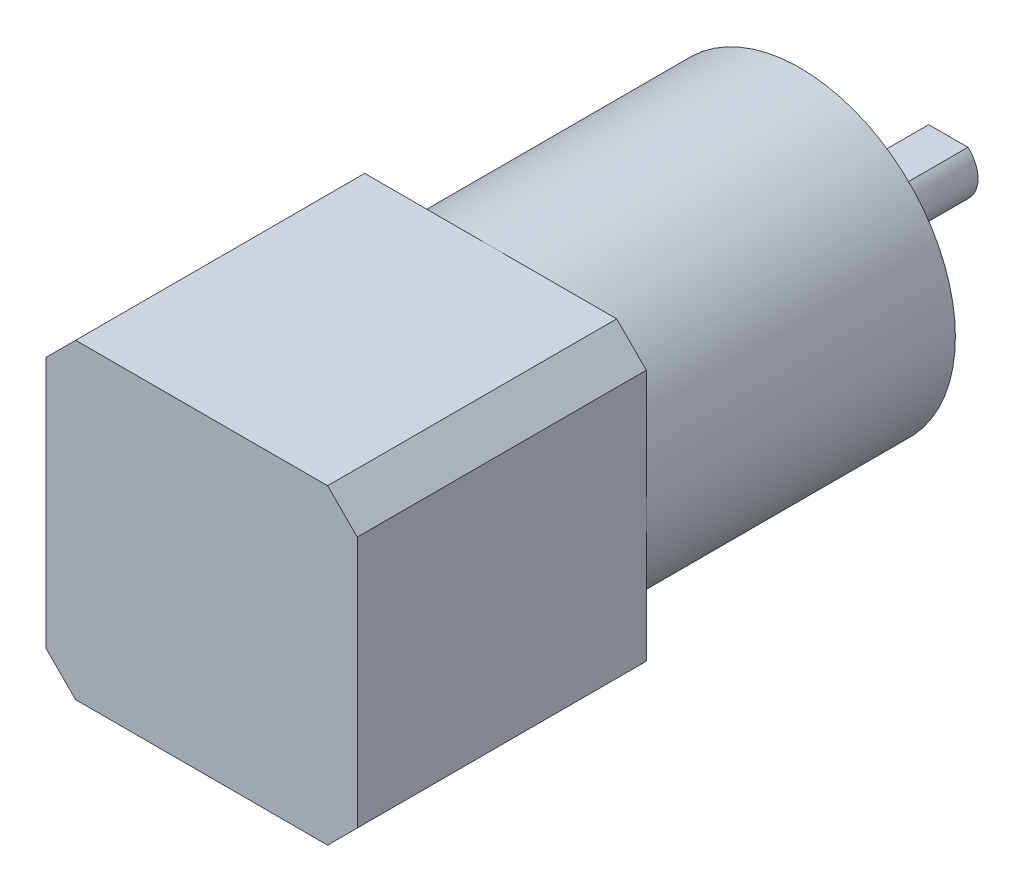
ISO-10303-21;
HEADER;
FILE_DESCRIPTION(('STEP AP214'),'2;1');
FILE_NAME('part.step','',(''),(''),'','','');
FILE_SCHEMA(('AUTOMOTIVE_DESIGN { 1 0 10303 214 1 1 1 1 }'));
ENDSEC;
DATA;
#1=APPLICATION_CONTEXT('core data for automotive mechanical design processes');
#2=APPLICATION_PROTOCOL_DEFINITION('international standard','automotive_design',2000,#1);
#3=PRODUCT_CONTEXT('',#1,'mechanical');
#4=PRODUCT('Part','Part','',(#3));
#5=PRODUCT_RELATED_PRODUCT_CATEGORY('part','',(#4));
#6=PRODUCT_DEFINITION_FORMATION('','',#4);
#7=PRODUCT_DEFINITION_CONTEXT('part definition',#1,'design');
#8=PRODUCT_DEFINITION('design','',#6,#7);
#9=PRODUCT_DEFINITION_SHAPE('','',#8);
#10=(LENGTH_UNIT() NAMED_UNIT(*) SI_UNIT(.MILLI.,.METRE.));
#11=(NAMED_UNIT(*) PLANE_ANGLE_UNIT() SI_UNIT($,.RADIAN.));
#12=(NAMED_UNIT(*) SI_UNIT($,.STERADIAN.) SOLID_ANGLE_UNIT());
#13=UNCERTAINTY_MEASURE_WITH_UNIT(LENGTH_MEASURE(1.E-05),#10,'distance_accuracy_value','');
#14=(GEOMETRIC_REPRESENTATION_CONTEXT(3) GLOBAL_UNCERTAINTY_ASSIGNED_CONTEXT((#13)) GLOBAL_UNIT_ASSIGNED_CONTEXT((#10,
#11,#12)) REPRESENTATION_CONTEXT('',''));
#15=CARTESIAN_POINT('',(0.,0.,0.));
#16=DIRECTION('',(0.,0.,1.));
#17=DIRECTION('',(1.,0.,0.));
#18=AXIS2_PLACEMENT_3D('',#15,#16,#17);
#19=CARTESIAN_POINT('',(21.,21.,39.));
#20=DIRECTION('',(-1.,0.,0.));
#21=DIRECTION('',(0.,-1.,0.));
#22=AXIS2_PLACEMENT_3D('',#19,#20,#21);
#23=PLANE('',#22);
#24=DIRECTION('',(0.,1.,0.));
#25=VECTOR('',#24,1.);
#26=CARTESIAN_POINT('',(21.,21.,39.));
#27=LINE('',#26,#25);
#28=CARTESIAN_POINT('',(21.,-17.,39.));
#29=VERTEX_POINT('',#28);
#30=CARTESIAN_POINT('',(21.,17.,39.));
#31=VERTEX_POINT('',#30);
#32=EDGE_CURVE('E145',#29,#31,#27,.T.);
#33=ORIENTED_EDGE('',*,*,#32,.F.);
#34=DIRECTION('',(0.,0.,-1.));
#35=VECTOR('',#34,1.);
#36=CARTESIAN_POINT('',(21.,-17.,39.));
#37=LINE('',#36,#35);
#38=CARTESIAN_POINT('',(21.,-17.,0.));
#39=VERTEX_POINT('',#38);
#40=EDGE_CURVE('E194',#29,#39,#37,.T.);
#41=ORIENTED_EDGE('',*,*,#40,.T.);
#42=DIRECTION('',(0.,1.,0.));
#43=VECTOR('',#42,1.);
#44=CARTESIAN_POINT('',(21.,21.,0.));
#45=LINE('',#44,#43);
#46=CARTESIAN_POINT('',(21.,17.,0.));
#47=VERTEX_POINT('',#46);
#48=EDGE_CURVE('E142',#39,#47,#45,.T.);
#49=ORIENTED_EDGE('',*,*,#48,.T.);
#50=DIRECTION('',(0.,0.,1.));
#51=VECTOR('',#50,1.);
#52=CARTESIAN_POINT('',(21.,17.,39.));
#53=LINE('',#52,#51);
#54=EDGE_CURVE('E192',#47,#31,#53,.T.);
#55=ORIENTED_EDGE('',*,*,#54,.T.);
#56=EDGE_LOOP('',(#33,#41,#49,#55));
#57=FACE_BOUND('',#56,.T.);
#58=ADVANCED_FACE('F37',(#57),#23,.F.);
#59=CARTESIAN_POINT('',(-21.,21.,39.));
#60=DIRECTION('',(0.,-1.,0.));
#61=DIRECTION('',(0.,0.,-1.));
#62=AXIS2_PLACEMENT_3D('',#59,#60,#61);
#63=PLANE('',#62);
#64=DIRECTION('',(-1.,0.,0.));
#65=VECTOR('',#64,1.);
#66=CARTESIAN_POINT('',(-21.,21.,0.));
#67=LINE('',#66,#65);
#68=CARTESIAN_POINT('',(17.,21.,0.));
#69=VERTEX_POINT('',#68);
#70=CARTESIAN_POINT('',(-17.,21.,0.));
#71=VERTEX_POINT('',#70);
#72=EDGE_CURVE('E160',#69,#71,#67,.T.);
#73=ORIENTED_EDGE('',*,*,#72,.T.);
#74=DIRECTION('',(0.,0.,1.));
#75=VECTOR('',#74,1.);
#76=CARTESIAN_POINT('',(-17.,21.,39.));
#77=LINE('',#76,#75);
#78=CARTESIAN_POINT('',(-17.,21.,39.));
#79=VERTEX_POINT('',#78);
#80=EDGE_CURVE('E42',#71,#79,#77,.T.);
#81=ORIENTED_EDGE('',*,*,#80,.T.);
#82=DIRECTION('',(-1.,0.,0.));
#83=VECTOR('',#82,1.);
#84=CARTESIAN_POINT('',(-21.,21.,39.));
#85=LINE('',#84,#83);
#86=CARTESIAN_POINT('',(17.,21.,39.));
#87=VERTEX_POINT('',#86);
#88=EDGE_CURVE('E148',#87,#79,#85,.T.);
#89=ORIENTED_EDGE('',*,*,#88,.F.);
#90=DIRECTION('',(0.,0.,-1.));
#91=VECTOR('',#90,1.);
#92=CARTESIAN_POINT('',(17.,21.,39.));
#93=LINE('',#92,#91);
#94=EDGE_CURVE('E196',#87,#69,#93,.T.);
#95=ORIENTED_EDGE('',*,*,#94,.T.);
#96=EDGE_LOOP('',(#73,#81,#89,#95));
#97=FACE_BOUND('',#96,.T.);
#98=ADVANCED_FACE('F200',(#97),#63,.F.);
#99=CARTESIAN_POINT('',(-21.,21.,39.));
#100=DIRECTION('',(1.,0.,0.));
#101=DIRECTION('',(0.,1.,0.));
#102=AXIS2_PLACEMENT_3D('',#99,#100,#101);
#103=PLANE('',#102);
#104=DIRECTION('',(0.,-1.,0.));
#105=VECTOR('',#104,1.);
#106=CARTESIAN_POINT('',(-21.,21.,0.));
#107=LINE('',#106,#105);
#108=CARTESIAN_POINT('',(-21.,17.,0.));
#109=VERTEX_POINT('',#108);
#110=CARTESIAN_POINT('',(-21.,-17.,0.));
#111=VERTEX_POINT('',#110);
#112=EDGE_CURVE('E162',#109,#111,#107,.T.);
#113=ORIENTED_EDGE('',*,*,#112,.T.);
#114=DIRECTION('',(0.,0.,1.));
#115=VECTOR('',#114,1.);
#116=CARTESIAN_POINT('',(-21.,-17.,39.));
#117=LINE('',#116,#115);
#118=CARTESIAN_POINT('',(-21.,-17.,39.));
#119=VERTEX_POINT('',#118);
#120=EDGE_CURVE('E182',#111,#119,#117,.T.);
#121=ORIENTED_EDGE('',*,*,#120,.T.);
#122=DIRECTION('',(0.,-1.,0.));
#123=VECTOR('',#122,1.);
#124=CARTESIAN_POINT('',(-21.,21.,39.));
#125=LINE('',#124,#123);
#126=CARTESIAN_POINT('',(-21.,17.,39.));
#127=VERTEX_POINT('',#126);
#128=EDGE_CURVE('E151',#127,#119,#125,.T.);
#129=ORIENTED_EDGE('',*,*,#128,.F.);
#130=DIRECTION('',(0.,0.,-1.));
#131=VECTOR('',#130,1.);
#132=CARTESIAN_POINT('',(-21.,17.,39.));
#133=LINE('',#132,#131);
#134=EDGE_CURVE('E179',#127,#109,#133,.T.);
#135=ORIENTED_EDGE('',*,*,#134,.T.);
#136=EDGE_LOOP('',(#113,#121,#129,#135));
#137=FACE_BOUND('',#136,.T.);
#138=ADVANCED_FACE('F214',(#137),#103,.F.);
#139=CARTESIAN_POINT('',(-21.,-21.,39.));
#140=DIRECTION('',(0.,1.,0.));
#141=DIRECTION('',(0.,0.,1.));
#142=AXIS2_PLACEMENT_3D('',#139,#140,#141);
#143=PLANE('',#142);
#144=DIRECTION('',(1.,0.,0.));
#145=VECTOR('',#144,1.);
#146=CARTESIAN_POINT('',(-21.,-21.,39.));
#147=LINE('',#146,#145);
#148=CARTESIAN_POINT('',(-17.,-21.,39.));
#149=VERTEX_POINT('',#148);
#150=CARTESIAN_POINT('',(17.,-21.,39.));
#151=VERTEX_POINT('',#150);
#152=EDGE_CURVE('E154',#149,#151,#147,.T.);
#153=ORIENTED_EDGE('',*,*,#152,.F.);
#154=DIRECTION('',(0.,0.,-1.));
#155=VECTOR('',#154,1.);
#156=CARTESIAN_POINT('',(-17.,-21.,39.));
#157=LINE('',#156,#155);
#158=CARTESIAN_POINT('',(-17.,-21.,0.));
#159=VERTEX_POINT('',#158);
#160=EDGE_CURVE('E168',#149,#159,#157,.T.);
#161=ORIENTED_EDGE('',*,*,#160,.T.);
#162=DIRECTION('',(1.,0.,0.));
#163=VECTOR('',#162,1.);
#164=CARTESIAN_POINT('',(-21.,-21.,0.));
#165=LINE('',#164,#163);
#166=CARTESIAN_POINT('',(17.,-21.,0.));
#167=VERTEX_POINT('',#166);
#168=EDGE_CURVE('E149',#159,#167,#165,.T.);
#169=ORIENTED_EDGE('',*,*,#168,.T.);
#170=DIRECTION('',(0.,0.,1.));
#171=VECTOR('',#170,1.);
#172=CARTESIAN_POINT('',(17.,-21.,39.));
#173=LINE('',#172,#171);
#174=EDGE_CURVE('E157',#167,#151,#173,.T.);
#175=ORIENTED_EDGE('',*,*,#174,.T.);
#176=EDGE_LOOP('',(#153,#161,#169,#175));
#177=FACE_BOUND('',#176,.T.);
#178=ADVANCED_FACE('F224',(#177),#143,.F.);
#179=CARTESIAN_POINT('',(0.,0.,39.));
#180=DIRECTION('',(0.,0.,1.));
#181=DIRECTION('',(1.,0.,0.));
#182=AXIS2_PLACEMENT_3D('',#179,#180,#181);
#183=PLANE('',#182);
#184=ORIENTED_EDGE('',*,*,#128,.T.);
#185=DIRECTION('',(-0.707106781186546,0.707106781186549,0.));
#186=VECTOR('',#185,1.);
#187=CARTESIAN_POINT('',(-19.,-19.,39.));
#188=LINE('',#187,#186);
#189=EDGE_CURVE('E190',#119,#149,#188,.F.);
#190=ORIENTED_EDGE('',*,*,#189,.T.);
#191=ORIENTED_EDGE('',*,*,#152,.T.);
#192=DIRECTION('',(-0.707106781186549,-0.707106781186546,0.));
#193=VECTOR('',#192,1.);
#194=CARTESIAN_POINT('',(19.,-19.,39.));
#195=LINE('',#194,#193);
#196=EDGE_CURVE('E188',#151,#29,#195,.F.);
#197=ORIENTED_EDGE('',*,*,#196,.T.);
#198=ORIENTED_EDGE('',*,*,#32,.T.);
#199=DIRECTION('',(0.707106781186546,-0.707106781186549,0.));
#200=VECTOR('',#199,1.);
#201=CARTESIAN_POINT('',(19.,19.,39.));
#202=LINE('',#201,#200);
#203=EDGE_CURVE('E184',#31,#87,#202,.F.);
#204=ORIENTED_EDGE('',*,*,#203,.T.);
#205=ORIENTED_EDGE('',*,*,#88,.T.);
#206=DIRECTION('',(0.707106781186549,0.707106781186546,0.));
#207=VECTOR('',#206,1.);
#208=CARTESIAN_POINT('',(-19.,19.,39.));
#209=LINE('',#208,#207);
#210=EDGE_CURVE('E186',#79,#127,#209,.F.);
#211=ORIENTED_EDGE('',*,*,#210,.T.);
#212=EDGE_LOOP('',(#184,#190,#191,#197,#198,#204,#205,#211));
#213=FACE_BOUND('',#212,.T.);
#214=ADVANCED_FACE('F218',(#213),#183,.T.);
#215=CARTESIAN_POINT('',(0.,0.,0.));
#216=DIRECTION('',(0.,0.,1.));
#217=DIRECTION('',(1.,0.,0.));
#218=AXIS2_PLACEMENT_3D('',#215,#216,#217);
#219=PLANE('',#218);
#220=CARTESIAN_POINT('',(0.,0.,0.));
#221=DIRECTION('',(0.,0.,-1.));
#222=DIRECTION('',(-1.,0.,0.));
#223=AXIS2_PLACEMENT_3D('',#220,#221,#222);
#224=CIRCLE('',#223,20.95);
#225=CARTESIAN_POINT('',(20.95,0.,0.));
#226=VERTEX_POINT('',#225);
#227=EDGE_CURVE('E47',#226,#226,#224,.T.);
#228=ORIENTED_EDGE('',*,*,#227,.F.);
#229=EDGE_LOOP('',(#228));
#230=FACE_BOUND('',#229,.T.);
#231=ORIENTED_EDGE('',*,*,#168,.F.);
#232=DIRECTION('',(0.707106781186546,-0.707106781186549,0.));
#233=VECTOR('',#232,1.);
#234=CARTESIAN_POINT('',(-17.,-21.,0.));
#235=LINE('',#234,#233);
#236=EDGE_CURVE('E177',#159,#111,#235,.F.);
#237=ORIENTED_EDGE('',*,*,#236,.T.);
#238=ORIENTED_EDGE('',*,*,#112,.F.);
#239=DIRECTION('',(-0.707106781186549,-0.707106781186546,0.));
#240=VECTOR('',#239,1.);
#241=CARTESIAN_POINT('',(-21.,17.,0.));
#242=LINE('',#241,#240);
#243=EDGE_CURVE('E173',#109,#71,#242,.F.);
#244=ORIENTED_EDGE('',*,*,#243,.T.);
#245=ORIENTED_EDGE('',*,*,#72,.F.);
#246=DIRECTION('',(-0.707106781186546,0.707106781186549,0.));
#247=VECTOR('',#246,1.);
#248=CARTESIAN_POINT('',(17.,21.,0.));
#249=LINE('',#248,#247);
#250=EDGE_CURVE('E171',#69,#47,#249,.F.);
#251=ORIENTED_EDGE('',*,*,#250,.T.);
#252=ORIENTED_EDGE('',*,*,#48,.F.);
#253=DIRECTION('',(0.707106781186549,0.707106781186546,0.));
#254=VECTOR('',#253,1.);
#255=CARTESIAN_POINT('',(21.,-17.,0.));
#256=LINE('',#255,#254);
#257=EDGE_CURVE('E175',#39,#167,#256,.F.);
#258=ORIENTED_EDGE('',*,*,#257,.T.);
#259=EDGE_LOOP('',(#231,#237,#238,#244,#245,#251,#252,#258));
#260=FACE_BOUND('',#259,.T.);
#261=ADVANCED_FACE('F205',(#230,#260),#219,.F.);
#262=CARTESIAN_POINT('',(-17.,-21.,39.));
#263=DIRECTION('',(0.707106781186549,0.707106781186546,0.));
#264=DIRECTION('',(0.,0.,-1.));
#265=AXIS2_PLACEMENT_3D('',#262,#263,#264);
#266=PLANE('',#265);
#267=ORIENTED_EDGE('',*,*,#189,.F.);
#268=ORIENTED_EDGE('',*,*,#120,.F.);
#269=ORIENTED_EDGE('',*,*,#236,.F.);
#270=ORIENTED_EDGE('',*,*,#160,.F.);
#271=EDGE_LOOP('',(#267,#268,#269,#270));
#272=FACE_BOUND('',#271,.T.);
#273=ADVANCED_FACE('F222',(#272),#266,.F.);
#274=CARTESIAN_POINT('',(21.,-17.,39.));
#275=DIRECTION('',(-0.707106781186546,0.707106781186549,0.));
#276=DIRECTION('',(0.,0.,-1.));
#277=AXIS2_PLACEMENT_3D('',#274,#275,#276);
#278=PLANE('',#277);
#279=ORIENTED_EDGE('',*,*,#196,.F.);
#280=ORIENTED_EDGE('',*,*,#174,.F.);
#281=ORIENTED_EDGE('',*,*,#257,.F.);
#282=ORIENTED_EDGE('',*,*,#40,.F.);
#283=EDGE_LOOP('',(#279,#280,#281,#282));
#284=FACE_BOUND('',#283,.T.);
#285=ADVANCED_FACE('F229',(#284),#278,.F.);
#286=CARTESIAN_POINT('',(-21.,17.,39.));
#287=DIRECTION('',(0.707106781186546,-0.707106781186549,0.));
#288=DIRECTION('',(0.,0.,-1.));
#289=AXIS2_PLACEMENT_3D('',#286,#287,#288);
#290=PLANE('',#289);
#291=ORIENTED_EDGE('',*,*,#210,.F.);
#292=ORIENTED_EDGE('',*,*,#80,.F.);
#293=ORIENTED_EDGE('',*,*,#243,.F.);
#294=ORIENTED_EDGE('',*,*,#134,.F.);
#295=EDGE_LOOP('',(#291,#292,#293,#294));
#296=FACE_BOUND('',#295,.T.);
#297=ADVANCED_FACE('F211',(#296),#290,.F.);
#298=CARTESIAN_POINT('',(17.,21.,39.));
#299=DIRECTION('',(-0.707106781186549,-0.707106781186546,0.));
#300=DIRECTION('',(0.,0.,-1.));
#301=AXIS2_PLACEMENT_3D('',#298,#299,#300);
#302=PLANE('',#301);
#303=ORIENTED_EDGE('',*,*,#203,.F.);
#304=ORIENTED_EDGE('',*,*,#54,.F.);
#305=ORIENTED_EDGE('',*,*,#250,.F.);
#306=ORIENTED_EDGE('',*,*,#94,.F.);
#307=EDGE_LOOP('',(#303,#304,#305,#306));
#308=FACE_BOUND('',#307,.T.);
#309=ADVANCED_FACE('F40',(#308),#302,.F.);
#310=CARTESIAN_POINT('',(0.,0.,-41.75));
#311=DIRECTION('',(0.,0.,1.));
#312=DIRECTION('',(1.,0.,0.));
#313=AXIS2_PLACEMENT_3D('',#310,#311,#312);
#314=CYLINDRICAL_SURFACE('',#313,20.95);
#315=CARTESIAN_POINT('',(0.,0.,-41.75));
#316=DIRECTION('',(0.,0.,-1.));
#317=DIRECTION('',(-1.,0.,0.));
#318=AXIS2_PLACEMENT_3D('',#315,#316,#317);
#319=CIRCLE('',#318,20.95);
#320=CARTESIAN_POINT('',(20.95,0.,-41.75));
#321=VERTEX_POINT('',#320);
#322=EDGE_CURVE('E138',#321,#321,#319,.T.);
#323=CARTESIAN_POINT('',(20.95,0.,-41.75));
#324=CARTESIAN_POINT('',(20.95,0.,-41.3151041666667));
#325=CARTESIAN_POINT('',(20.95,0.,-40.8802083333333));
#326=CARTESIAN_POINT('',(20.95,0.,-40.0104166666667));
#327=CARTESIAN_POINT('',(20.95,0.,-39.5755208333333));
#328=CARTESIAN_POINT('',(20.95,0.,-38.7057291666667));
#329=CARTESIAN_POINT('',(20.95,0.,-38.2708333333333));
#330=CARTESIAN_POINT('',(20.95,0.,-37.4010416666667));
#331=CARTESIAN_POINT('',(20.95,0.,-36.9661458333333));
#332=CARTESIAN_POINT('',(20.95,0.,-36.0963541666667));
#333=CARTESIAN_POINT('',(20.95,0.,-35.6614583333333));
#334=CARTESIAN_POINT('',(20.95,0.,-34.7916666666667));
#335=CARTESIAN_POINT('',(20.95,0.,-34.3567708333333));
#336=CARTESIAN_POINT('',(20.95,0.,-33.4869791666667));
#337=CARTESIAN_POINT('',(20.95,0.,-33.0520833333333));
#338=CARTESIAN_POINT('',(20.95,0.,-32.1822916666667));
#339=CARTESIAN_POINT('',(20.95,0.,-31.7473958333333));
#340=CARTESIAN_POINT('',(20.95,0.,-30.8776041666667));
#341=CARTESIAN_POINT('',(20.95,0.,-30.4427083333333));
#342=CARTESIAN_POINT('',(20.95,0.,-29.5729166666667));
#343=CARTESIAN_POINT('',(20.95,0.,-29.1380208333333));
#344=CARTESIAN_POINT('',(20.95,0.,-28.2682291666667));
#345=CARTESIAN_POINT('',(20.95,0.,-27.8333333333333));
#346=CARTESIAN_POINT('',(20.95,0.,-26.9635416666667));
#347=CARTESIAN_POINT('',(20.95,0.,-26.5286458333333));
#348=CARTESIAN_POINT('',(20.95,0.,-25.6588541666667));
#349=CARTESIAN_POINT('',(20.95,0.,-25.2239583333333));
#350=CARTESIAN_POINT('',(20.95,0.,-24.3541666666667));
#351=CARTESIAN_POINT('',(20.95,0.,-23.9192708333333));
#352=CARTESIAN_POINT('',(20.95,0.,-23.0494791666667));
#353=CARTESIAN_POINT('',(20.95,0.,-22.6145833333333));
#354=CARTESIAN_POINT('',(20.95,0.,-21.7447916666667));
#355=CARTESIAN_POINT('',(20.95,0.,-21.3098958333333));
#356=CARTESIAN_POINT('',(20.95,0.,-20.4401041666667));
#357=CARTESIAN_POINT('',(20.95,0.,-20.0052083333333));
#358=CARTESIAN_POINT('',(20.95,0.,-19.1354166666667));
#359=CARTESIAN_POINT('',(20.95,0.,-18.7005208333333));
#360=CARTESIAN_POINT('',(20.95,0.,-17.8307291666667));
#361=CARTESIAN_POINT('',(20.95,0.,-17.3958333333333));
#362=CARTESIAN_POINT('',(20.95,0.,-16.5260416666667));
#363=CARTESIAN_POINT('',(20.95,0.,-16.0911458333333));
#364=CARTESIAN_POINT('',(20.95,0.,-15.2213541666667));
#365=CARTESIAN_POINT('',(20.95,0.,-14.7864583333333));
#366=CARTESIAN_POINT('',(20.95,0.,-13.9166666666667));
#367=CARTESIAN_POINT('',(20.95,0.,-13.4817708333333));
#368=CARTESIAN_POINT('',(20.95,0.,-12.6119791666667));
#369=CARTESIAN_POINT('',(20.95,0.,-12.1770833333333));
#370=CARTESIAN_POINT('',(20.95,0.,-11.3072916666667));
#371=CARTESIAN_POINT('',(20.95,0.,-10.8723958333333));
#372=CARTESIAN_POINT('',(20.95,0.,-10.0026041666667));
#373=CARTESIAN_POINT('',(20.95,0.,-9.56770833333334));
#374=CARTESIAN_POINT('',(20.95,0.,-8.69791666666667));
#375=CARTESIAN_POINT('',(20.95,0.,-8.26302083333333));
#376=CARTESIAN_POINT('',(20.95,0.,-7.39322916666667));
#377=CARTESIAN_POINT('',(20.95,0.,-6.95833333333333));
#378=CARTESIAN_POINT('',(20.95,0.,-6.08854166666667));
#379=CARTESIAN_POINT('',(20.95,0.,-5.65364583333333));
#380=CARTESIAN_POINT('',(20.95,0.,-4.78385416666667));
#381=CARTESIAN_POINT('',(20.95,0.,-4.34895833333334));
#382=CARTESIAN_POINT('',(20.95,0.,-3.47916666666667));
#383=CARTESIAN_POINT('',(20.95,0.,-3.04427083333333));
#384=CARTESIAN_POINT('',(20.95,0.,-2.17447916666666));
#385=CARTESIAN_POINT('',(20.95,0.,-1.73958333333333));
#386=CARTESIAN_POINT('',(20.95,0.,-0.869791666666666));
#387=CARTESIAN_POINT('',(20.95,0.,-0.434895833333333));
#388=CARTESIAN_POINT('',(20.95,0.,0.));
#389=B_SPLINE_CURVE_WITH_KNOTS('',3,(#323,#324,#325,#326,#327,#328,#329,#330,#331,#332,#333,
#334,#335,#336,#337,#338,#339,#340,#341,#342,#343,#344,#345,#346,#347,#348,#349,#350,#351,#352,
#353,#354,#355,#356,#357,#358,#359,#360,#361,#362,#363,#364,#365,#366,#367,#368,#369,#370,#371,
#372,#373,#374,#375,#376,#377,#378,#379,#380,#381,#382,#383,#384,#385,#386,#387,#388),
.UNSPECIFIED.,.F.,.F.,(4,2,2,2,2,2,2,2,2,2,2,2,2,2,2,2,2,2,2,2,2,2,2,2,2,2,2,2,2,2,2,2,4),(0.,
1.3046875,2.609375,3.9140625,5.21874999999999,6.52343749999999,7.82812499999999,9.1328125,
10.4375,11.7421875,13.046875,14.3515625,15.65625,16.9609375,18.265625,19.5703125,20.875,
22.1796875,23.484375,24.7890625,26.09375,27.3984375,28.703125,30.0078125,31.3125,32.6171875,
33.921875,35.2265625,36.53125,37.8359375,39.140625,40.4453125,41.75),.UNSPECIFIED.);
#390=EDGE_CURVE('BSEAM234',#321,#226,#389,.T.);
#391=ORIENTED_EDGE('',*,*,#322,.F.);
#392=ORIENTED_EDGE('',*,*,#227,.T.);
#393=ORIENTED_EDGE('',*,*,#390,.T.);
#394=ORIENTED_EDGE('',*,*,#390,.F.);
#395=EDGE_LOOP('',(#391,#393,#392,#394));
#396=FACE_BOUND('',#395,.T.);
#397=ADVANCED_FACE('F234',(#396),#314,.T.);
#398=CARTESIAN_POINT('',(0.,0.,-41.75));
#399=DIRECTION('',(0.,0.,-1.));
#400=DIRECTION('',(-1.,0.,0.));
#401=AXIS2_PLACEMENT_3D('',#398,#399,#400);
#402=PLANE('',#401);
#403=CARTESIAN_POINT('',(12.0208152801713,12.0208152801706,-41.75));
#404=DIRECTION('',(0.,0.,-1.));
#405=DIRECTION('',(-1.,0.,0.));
#406=AXIS2_PLACEMENT_3D('',#403,#404,#405);
#407=CIRCLE('',#406,2.0000000000007);
#408=CARTESIAN_POINT('',(10.0208152801706,12.0208152801706,-41.75));
#409=VERTEX_POINT('',#408);
#410=EDGE_CURVE('E461',#409,#409,#407,.T.);
#411=ORIENTED_EDGE('',*,*,#410,.F.);
#412=EDGE_LOOP('',(#411));
#413=FACE_BOUND('',#412,.T.);
#414=CARTESIAN_POINT('',(12.0208152801706,-12.020815280172,-41.75));
#415=DIRECTION('',(0.,0.,-1.));
#416=DIRECTION('',(-1.,0.,0.));
#417=AXIS2_PLACEMENT_3D('',#414,#415,#416);
#418=CIRCLE('',#417,2.00000000000048);
#419=CARTESIAN_POINT('',(10.0208152801702,-12.020815280172,-41.75));
#420=VERTEX_POINT('',#419);
#421=EDGE_CURVE('E460',#420,#420,#418,.T.);
#422=ORIENTED_EDGE('',*,*,#421,.F.);
#423=EDGE_LOOP('',(#422));
#424=FACE_BOUND('',#423,.T.);
#425=CARTESIAN_POINT('',(-12.020815280172,-12.0208152801713,-41.75));
#426=DIRECTION('',(0.,0.,-1.));
#427=DIRECTION('',(-1.,0.,0.));
#428=AXIS2_PLACEMENT_3D('',#425,#426,#427);
#429=CIRCLE('',#428,1.99999999999982);
#430=CARTESIAN_POINT('',(-14.0208152801718,-12.0208152801713,-41.75));
#431=VERTEX_POINT('',#430);
#432=EDGE_CURVE('E479',#431,#431,#429,.T.);
#433=ORIENTED_EDGE('',*,*,#432,.F.);
#434=EDGE_LOOP('',(#433));
#435=FACE_BOUND('',#434,.T.);
#436=CARTESIAN_POINT('',(-12.0208152801713,12.0208152801713,-41.75));
#437=DIRECTION('',(0.,0.,-1.));
#438=DIRECTION('',(-1.,0.,0.));
#439=AXIS2_PLACEMENT_3D('',#436,#437,#438);
#440=CIRCLE('',#439,2.);
#441=CARTESIAN_POINT('',(-14.0208152801713,12.0208152801713,-41.75));
#442=VERTEX_POINT('',#441);
#443=EDGE_CURVE('E473',#442,#442,#440,.T.);
#444=ORIENTED_EDGE('',*,*,#443,.F.);
#445=EDGE_LOOP('',(#444));
#446=FACE_BOUND('',#445,.T.);
#447=CARTESIAN_POINT('',(0.,0.,-41.75));
#448=DIRECTION('',(0.,0.,-1.));
#449=DIRECTION('',(-1.,0.,0.));
#450=AXIS2_PLACEMENT_3D('',#447,#448,#449);
#451=CIRCLE('',#450,4.);
#452=CARTESIAN_POINT('',(-4.,0.,-41.75));
#453=VERTEX_POINT('',#452);
#454=EDGE_CURVE('E11',#453,#453,#451,.T.);
#455=ORIENTED_EDGE('',*,*,#454,.F.);
#456=EDGE_LOOP('',(#455));
#457=FACE_BOUND('',#456,.T.);
#458=ORIENTED_EDGE('',*,*,#322,.T.);
#459=EDGE_LOOP('',(#458));
#460=FACE_BOUND('',#459,.T.);
#461=ADVANCED_FACE('F239',(#413,#424,#435,#446,#457,#460),#402,.T.);
#462=CARTESIAN_POINT('',(0.,0.,-61.75));
#463=DIRECTION('',(0.,0.,1.));
#464=DIRECTION('',(1.,0.,0.));
#465=AXIS2_PLACEMENT_3D('',#462,#463,#464);
#466=CYLINDRICAL_SURFACE('',#465,4.);
#467=CARTESIAN_POINT('',(0.,0.,-61.75));
#468=DIRECTION('',(0.,0.,-1.));
#469=DIRECTION('',(-1.,0.,0.));
#470=AXIS2_PLACEMENT_3D('',#467,#468,#469);
#471=CIRCLE('',#470,4.);
#472=CARTESIAN_POINT('',(2.64575131106459,3.,-61.75));
#473=VERTEX_POINT('',#472);
#474=CARTESIAN_POINT('',(-2.64575131106459,3.,-61.75));
#475=VERTEX_POINT('',#474);
#476=EDGE_CURVE('E133',#473,#475,#471,.T.);
#477=ORIENTED_EDGE('',*,*,#476,.F.);
#478=DIRECTION('',(0.,0.,-1.));
#479=VECTOR('',#478,1.);
#480=CARTESIAN_POINT('',(2.64575131106459,3.,-46.75));
#481=LINE('',#480,#479);
#482=CARTESIAN_POINT('',(2.64575131106459,3.,-46.75));
#483=VERTEX_POINT('',#482);
#484=EDGE_CURVE('E55',#483,#473,#481,.T.);
#485=ORIENTED_EDGE('',*,*,#484,.F.);
#486=CARTESIAN_POINT('',(0.,0.,-46.75));
#487=DIRECTION('',(0.,0.,-1.));
#488=DIRECTION('',(-1.,0.,0.));
#489=AXIS2_PLACEMENT_3D('',#486,#487,#488);
#490=CIRCLE('',#489,4.);
#491=CARTESIAN_POINT('',(-2.64575131106459,3.,-46.75));
#492=VERTEX_POINT('',#491);
#493=EDGE_CURVE('E119',#492,#483,#490,.T.);
#494=ORIENTED_EDGE('',*,*,#493,.F.);
#495=DIRECTION('',(0.,0.,-1.));
#496=VECTOR('',#495,1.);
#497=CARTESIAN_POINT('',(-2.64575131106459,3.,-46.75));
#498=LINE('',#497,#496);
#499=EDGE_CURVE('E127',#492,#475,#498,.T.);
#500=ORIENTED_EDGE('',*,*,#499,.T.);
#501=EDGE_LOOP('',(#477,#485,#494,#500));
#502=FACE_BOUND('',#501,.T.);
#503=ORIENTED_EDGE('',*,*,#454,.T.);
#504=EDGE_LOOP('',(#503));
#505=FACE_BOUND('',#504,.T.);
#506=ADVANCED_FACE('F130',(#502,#505),#466,.T.);
#507=CARTESIAN_POINT('',(0.,0.,-61.75));
#508=DIRECTION('',(0.,0.,-1.));
#509=DIRECTION('',(-1.,0.,0.));
#510=AXIS2_PLACEMENT_3D('',#507,#508,#509);
#511=PLANE('',#510);
#512=DIRECTION('',(-1.,0.,0.));
#513=VECTOR('',#512,1.);
#514=CARTESIAN_POINT('',(2.64575131106459,3.,-61.75));
#515=LINE('',#514,#513);
#516=EDGE_CURVE('E124',#473,#475,#515,.T.);
#517=ORIENTED_EDGE('',*,*,#516,.F.);
#518=ORIENTED_EDGE('',*,*,#476,.T.);
#519=EDGE_LOOP('',(#517,#518));
#520=FACE_BOUND('',#519,.T.);
#521=ADVANCED_FACE('F305',(#520),#511,.T.);
#522=CARTESIAN_POINT('',(2.64575131106459,3.,-46.75));
#523=DIRECTION('',(0.,-1.,0.));
#524=DIRECTION('',(1.,0.,0.));
#525=AXIS2_PLACEMENT_3D('',#522,#523,#524);
#526=PLANE('',#525);
#527=ORIENTED_EDGE('',*,*,#516,.T.);
#528=ORIENTED_EDGE('',*,*,#499,.F.);
#529=DIRECTION('',(-1.,0.,0.));
#530=VECTOR('',#529,1.);
#531=CARTESIAN_POINT('',(2.64575131106459,3.,-46.75));
#532=LINE('',#531,#530);
#533=EDGE_CURVE('E121',#483,#492,#532,.T.);
#534=ORIENTED_EDGE('',*,*,#533,.F.);
#535=ORIENTED_EDGE('',*,*,#484,.T.);
#536=EDGE_LOOP('',(#527,#528,#534,#535));
#537=FACE_BOUND('',#536,.T.);
#538=ADVANCED_FACE('F126',(#537),#526,.F.);
#539=CARTESIAN_POINT('',(0.,0.,-46.75));
#540=DIRECTION('',(0.,0.,-1.));
#541=DIRECTION('',(-1.,0.,0.));
#542=AXIS2_PLACEMENT_3D('',#539,#540,#541);
#543=PLANE('',#542);
#544=ORIENTED_EDGE('',*,*,#493,.T.);
#545=ORIENTED_EDGE('',*,*,#533,.T.);
#546=EDGE_LOOP('',(#544,#545));
#547=FACE_BOUND('',#546,.T.);
#548=ADVANCED_FACE('F120',(#547),#543,.T.);
#549=CARTESIAN_POINT('',(-12.0208152801713,12.0208152801713,-21.75));
#550=DIRECTION('',(0.,0.,-1.));
#551=DIRECTION('',(-1.,0.,0.));
#552=AXIS2_PLACEMENT_3D('',#549,#550,#551);
#553=CYLINDRICAL_SURFACE('',#552,2.);
#554=CARTESIAN_POINT('',(-12.0208152801713,12.0208152801713,-21.75));
#555=DIRECTION('',(0.,0.,-1.));
#556=DIRECTION('',(-1.,0.,0.));
#557=AXIS2_PLACEMENT_3D('',#554,#555,#556);
#558=CIRCLE('',#557,2.);
#559=CARTESIAN_POINT('',(-14.0208152801713,12.0208152801713,-21.75));
#560=VERTEX_POINT('',#559);
#561=EDGE_CURVE('E470',#560,#560,#558,.T.);
#562=ORIENTED_EDGE('',*,*,#561,.F.);
#563=EDGE_LOOP('',(#562));
#564=FACE_BOUND('',#563,.T.);
#565=ORIENTED_EDGE('',*,*,#443,.T.);
#566=EDGE_LOOP('',(#565));
#567=FACE_BOUND('',#566,.T.);
#568=ADVANCED_FACE('F331',(#564,#567),#553,.F.);
#569=CARTESIAN_POINT('',(-12.0208152801713,12.0208152801713,-21.75));
#570=DIRECTION('',(0.,0.,-1.));
#571=DIRECTION('',(-1.,0.,0.));
#572=AXIS2_PLACEMENT_3D('',#569,#570,#571);
#573=PLANE('',#572);
#574=ORIENTED_EDGE('',*,*,#561,.T.);
#575=EDGE_LOOP('',(#574));
#576=FACE_BOUND('',#575,.T.);
#577=ADVANCED_FACE('F347',(#576),#573,.T.);
#578=CARTESIAN_POINT('',(-12.020815280172,-12.0208152801713,-21.75));
#579=DIRECTION('',(0.,0.,-1.));
#580=DIRECTION('',(-1.,0.,0.));
#581=AXIS2_PLACEMENT_3D('',#578,#579,#580);
#582=CYLINDRICAL_SURFACE('',#581,1.99999999999982);
#583=CARTESIAN_POINT('',(-12.020815280172,-12.0208152801713,-21.75));
#584=DIRECTION('',(0.,0.,-1.));
#585=DIRECTION('',(-1.,0.,0.));
#586=AXIS2_PLACEMENT_3D('',#583,#584,#585);
#587=CIRCLE('',#586,1.99999999999982);
#588=CARTESIAN_POINT('',(-14.0208152801718,-12.0208152801713,-21.75));
#589=VERTEX_POINT('',#588);
#590=EDGE_CURVE('E475',#589,#589,#587,.T.);
#591=ORIENTED_EDGE('',*,*,#590,.F.);
#592=EDGE_LOOP('',(#591));
#593=FACE_BOUND('',#592,.T.);
#594=ORIENTED_EDGE('',*,*,#432,.T.);
#595=EDGE_LOOP('',(#594));
#596=FACE_BOUND('',#595,.T.);
#597=ADVANCED_FACE('F357',(#593,#596),#582,.F.);
#598=CARTESIAN_POINT('',(-12.020815280172,-12.0208152801713,-21.75));
#599=DIRECTION('',(0.,0.,-1.));
#600=DIRECTION('',(-1.,0.,0.));
#601=AXIS2_PLACEMENT_3D('',#598,#599,#600);
#602=PLANE('',#601);
#603=ORIENTED_EDGE('',*,*,#590,.T.);
#604=EDGE_LOOP('',(#603));
#605=FACE_BOUND('',#604,.T.);
#606=ADVANCED_FACE('F367',(#605),#602,.T.);
#607=CARTESIAN_POINT('',(12.0208152801706,-12.020815280172,-21.75));
#608=DIRECTION('',(0.,0.,-1.));
#609=DIRECTION('',(-1.,0.,0.));
#610=AXIS2_PLACEMENT_3D('',#607,#608,#609);
#611=CYLINDRICAL_SURFACE('',#610,2.00000000000048);
#612=CARTESIAN_POINT('',(12.0208152801706,-12.020815280172,-21.75));
#613=DIRECTION('',(0.,0.,-1.));
#614=DIRECTION('',(-1.,0.,0.));
#615=AXIS2_PLACEMENT_3D('',#612,#613,#614);
#616=CIRCLE('',#615,2.00000000000048);
#617=CARTESIAN_POINT('',(10.0208152801702,-12.020815280172,-21.75));
#618=VERTEX_POINT('',#617);
#619=EDGE_CURVE('E464',#618,#618,#616,.T.);
#620=ORIENTED_EDGE('',*,*,#619,.F.);
#621=EDGE_LOOP('',(#620));
#622=FACE_BOUND('',#621,.T.);
#623=ORIENTED_EDGE('',*,*,#421,.T.);
#624=EDGE_LOOP('',(#623));
#625=FACE_BOUND('',#624,.T.);
#626=ADVANCED_FACE('F377',(#622,#625),#611,.F.);
#627=CARTESIAN_POINT('',(12.0208152801706,-12.020815280172,-21.75));
#628=DIRECTION('',(0.,0.,-1.));
#629=DIRECTION('',(-1.,0.,0.));
#630=AXIS2_PLACEMENT_3D('',#627,#628,#629);
#631=PLANE('',#630);
#632=ORIENTED_EDGE('',*,*,#619,.T.);
#633=EDGE_LOOP('',(#632));
#634=FACE_BOUND('',#633,.T.);
#635=ADVANCED_FACE('F387',(#634),#631,.T.);
#636=CARTESIAN_POINT('',(12.0208152801713,12.0208152801706,-21.75));
#637=DIRECTION('',(0.,0.,-1.));
#638=DIRECTION('',(-1.,0.,0.));
#639=AXIS2_PLACEMENT_3D('',#636,#637,#638);
#640=CYLINDRICAL_SURFACE('',#639,2.0000000000007);
#641=CARTESIAN_POINT('',(12.0208152801713,12.0208152801706,-21.75));
#642=DIRECTION('',(0.,0.,-1.));
#643=DIRECTION('',(-1.,0.,0.));
#644=AXIS2_PLACEMENT_3D('',#641,#642,#643);
#645=CIRCLE('',#644,2.0000000000007);
#646=CARTESIAN_POINT('',(10.0208152801706,12.0208152801706,-21.75));
#647=VERTEX_POINT('',#646);
#648=EDGE_CURVE('E459',#647,#647,#645,.T.);
#649=ORIENTED_EDGE('',*,*,#648,.F.);
#650=EDGE_LOOP('',(#649));
#651=FACE_BOUND('',#650,.T.);
#652=ORIENTED_EDGE('',*,*,#410,.T.);
#653=EDGE_LOOP('',(#652));
#654=FACE_BOUND('',#653,.T.);
#655=ADVANCED_FACE('F397',(#651,#654),#640,.F.);
#656=CARTESIAN_POINT('',(12.0208152801713,12.0208152801706,-21.75));
#657=DIRECTION('',(0.,0.,-1.));
#658=DIRECTION('',(-1.,0.,0.));
#659=AXIS2_PLACEMENT_3D('',#656,#657,#658);
#660=PLANE('',#659);
#661=ORIENTED_EDGE('',*,*,#648,.T.);
#662=EDGE_LOOP('',(#661));
#663=FACE_BOUND('',#662,.T.);
#664=ADVANCED_FACE('F407',(#663),#660,.T.);
#665=CLOSED_SHELL('',(#58,#98,#138,#178,#214,#261,#273,#285,#297,#309,#397,#461,#506,#521,#538,
#548,#568,#577,#597,#606,#626,#635,#655,#664));
#666=MANIFOLD_SOLID_BREP('B2',#665);
#667=ADVANCED_BREP_SHAPE_REPRESENTATION('',(#18,#666),#14);
#668=SHAPE_DEFINITION_REPRESENTATION(#9,#667);
ENDSEC;
END-ISO-10303-21;
